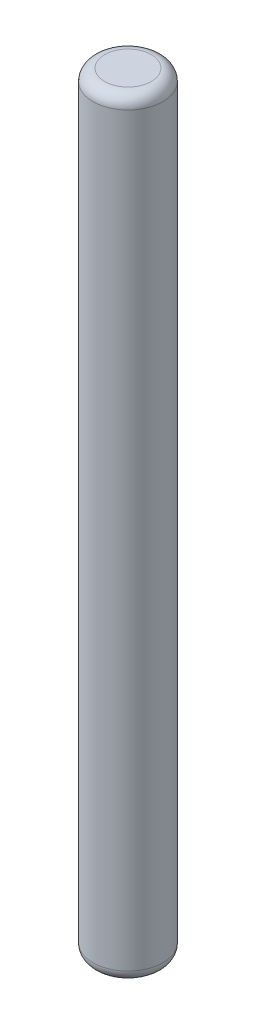
ISO-10303-21;
HEADER;
FILE_DESCRIPTION(('STEP AP214'),'2;1');
FILE_NAME('part.step','',(''),(''),'','','');
FILE_SCHEMA(('AUTOMOTIVE_DESIGN { 1 0 10303 214 1 1 1 1 }'));
ENDSEC;
DATA;
#1=APPLICATION_CONTEXT('core data for automotive mechanical design processes');
#2=APPLICATION_PROTOCOL_DEFINITION('international standard','automotive_design',2000,#1);
#3=PRODUCT_CONTEXT('',#1,'mechanical');
#4=PRODUCT('Part','Part','',(#3));
#5=PRODUCT_RELATED_PRODUCT_CATEGORY('part','',(#4));
#6=PRODUCT_DEFINITION_FORMATION('','',#4);
#7=PRODUCT_DEFINITION_CONTEXT('part definition',#1,'design');
#8=PRODUCT_DEFINITION('design','',#6,#7);
#9=PRODUCT_DEFINITION_SHAPE('','',#8);
#10=(LENGTH_UNIT() NAMED_UNIT(*) SI_UNIT(.MILLI.,.METRE.));
#11=(NAMED_UNIT(*) PLANE_ANGLE_UNIT() SI_UNIT($,.RADIAN.));
#12=(NAMED_UNIT(*) SI_UNIT($,.STERADIAN.) SOLID_ANGLE_UNIT());
#13=UNCERTAINTY_MEASURE_WITH_UNIT(LENGTH_MEASURE(1.E-05),#10,'distance_accuracy_value','');
#14=(GEOMETRIC_REPRESENTATION_CONTEXT(3) GLOBAL_UNCERTAINTY_ASSIGNED_CONTEXT((#13)) GLOBAL_UNIT_ASSIGNED_CONTEXT((#10,
#11,#12)) REPRESENTATION_CONTEXT('',''));
#15=CARTESIAN_POINT('',(0.,0.,0.));
#16=DIRECTION('',(0.,0.,1.));
#17=DIRECTION('',(1.,0.,0.));
#18=AXIS2_PLACEMENT_3D('',#15,#16,#17);
#19=CARTESIAN_POINT('',(0.,16.5000000000003,0.));
#20=DIRECTION('',(0.,-1.00000000000002,0.));
#21=DIRECTION('',(0.,0.,-1.00000000000002));
#22=AXIS2_PLACEMENT_3D('',#19,#20,#21);
#23=CYLINDRICAL_SURFACE('',#22,0.750000000000001);
#24=CARTESIAN_POINT('',(0.,0.25,0.));
#25=DIRECTION('',(0.,1.00000000000002,0.));
#26=DIRECTION('',(0.,0.,1.00000000000002));
#27=AXIS2_PLACEMENT_3D('',#24,#25,#26);
#28=CIRCLE('',#27,0.750000000000001);
#29=CARTESIAN_POINT('',(0.,0.250000000000001,0.750000000000021));
#30=VERTEX_POINT('',#29);
#31=EDGE_CURVE('E43',#30,#30,#28,.T.);
#32=ORIENTED_EDGE('',*,*,#31,.T.);
#33=EDGE_LOOP('',(#32));
#34=FACE_BOUND('',#33,.T.);
#35=CARTESIAN_POINT('',(0.,16.2500000000003,0.));
#36=DIRECTION('',(0.,1.00000000000002,0.));
#37=DIRECTION('',(0.,0.,1.00000000000002));
#38=AXIS2_PLACEMENT_3D('',#35,#36,#37);
#39=CIRCLE('',#38,0.750000000000001);
#40=CARTESIAN_POINT('',(0.,16.2500000000003,0.750000000000023));
#41=VERTEX_POINT('',#40);
#42=EDGE_CURVE('E47',#41,#41,#39,.F.);
#43=ORIENTED_EDGE('',*,*,#42,.T.);
#44=EDGE_LOOP('',(#43));
#45=FACE_BOUND('',#44,.T.);
#46=ADVANCED_FACE('F32',(#34,#45),#23,.T.);
#47=CARTESIAN_POINT('',(0.,16.5000000000003,0.));
#48=DIRECTION('',(0.,1.00000000000002,0.));
#49=DIRECTION('',(0.,0.,1.00000000000002));
#50=AXIS2_PLACEMENT_3D('',#47,#48,#49);
#51=PLANE('',#50);
#52=CARTESIAN_POINT('',(0.,16.5000000000003,0.));
#53=DIRECTION('',(0.,1.00000000000002,0.));
#54=DIRECTION('',(0.,0.,1.00000000000002));
#55=AXIS2_PLACEMENT_3D('',#52,#53,#54);
#56=CIRCLE('',#55,0.500000000000001);
#57=CARTESIAN_POINT('',(0.,16.5000000000003,0.500000000000019));
#58=VERTEX_POINT('',#57);
#59=EDGE_CURVE('E10',#58,#58,#56,.T.);
#60=ORIENTED_EDGE('',*,*,#59,.T.);
#61=EDGE_LOOP('',(#60));
#62=FACE_BOUND('',#61,.T.);
#63=ADVANCED_FACE('F63',(#62),#51,.T.);
#64=CARTESIAN_POINT('',(0.,0.,0.));
#65=DIRECTION('',(0.,1.00000000000002,0.));
#66=DIRECTION('',(0.,0.,1.00000000000002));
#67=AXIS2_PLACEMENT_3D('',#64,#65,#66);
#68=PLANE('',#67);
#69=CARTESIAN_POINT('',(0.,0.,0.));
#70=DIRECTION('',(0.,1.00000000000002,0.));
#71=DIRECTION('',(0.,0.,1.00000000000002));
#72=AXIS2_PLACEMENT_3D('',#69,#70,#71);
#73=CIRCLE('',#72,0.500000000000001);
#74=CARTESIAN_POINT('',(0.,0.,0.500000000000007));
#75=VERTEX_POINT('',#74);
#76=EDGE_CURVE('E39',#75,#75,#73,.F.);
#77=ORIENTED_EDGE('',*,*,#76,.T.);
#78=EDGE_LOOP('',(#77));
#79=FACE_BOUND('',#78,.T.);
#80=ADVANCED_FACE('F60',(#79),#68,.F.);
#81=CARTESIAN_POINT('',(0.,0.25,0.));
#82=DIRECTION('',(0.,1.00000000000002,0.));
#83=DIRECTION('',(0.,0.,1.00000000000002));
#84=AXIS2_PLACEMENT_3D('',#81,#82,#83);
#85=TOROIDAL_SURFACE('',#84,0.500000000000001,0.25);
#86=ORIENTED_EDGE('',*,*,#76,.F.);
#87=EDGE_LOOP('',(#86));
#88=FACE_BOUND('',#87,.T.);
#89=ORIENTED_EDGE('',*,*,#31,.F.);
#90=EDGE_LOOP('',(#89));
#91=FACE_BOUND('',#90,.T.);
#92=ADVANCED_FACE('F56',(#88,#91),#85,.T.);
#93=CARTESIAN_POINT('',(0.,16.2500000000003,0.));
#94=DIRECTION('',(0.,1.00000000000002,0.));
#95=DIRECTION('',(0.,0.,1.00000000000002));
#96=AXIS2_PLACEMENT_3D('',#93,#94,#95);
#97=TOROIDAL_SURFACE('',#96,0.500000000000001,0.25);
#98=ORIENTED_EDGE('',*,*,#42,.F.);
#99=EDGE_LOOP('',(#98));
#100=FACE_BOUND('',#99,.T.);
#101=ORIENTED_EDGE('',*,*,#59,.F.);
#102=EDGE_LOOP('',(#101));
#103=FACE_BOUND('',#102,.T.);
#104=ADVANCED_FACE('F34',(#100,#103),#97,.T.);
#105=CLOSED_SHELL('',(#46,#63,#80,#92,#104));
#106=MANIFOLD_SOLID_BREP('B2',#105);
#107=ADVANCED_BREP_SHAPE_REPRESENTATION('',(#18,#106),#14);
#108=SHAPE_DEFINITION_REPRESENTATION(#9,#107);
ENDSEC;
END-ISO-10303-21;
